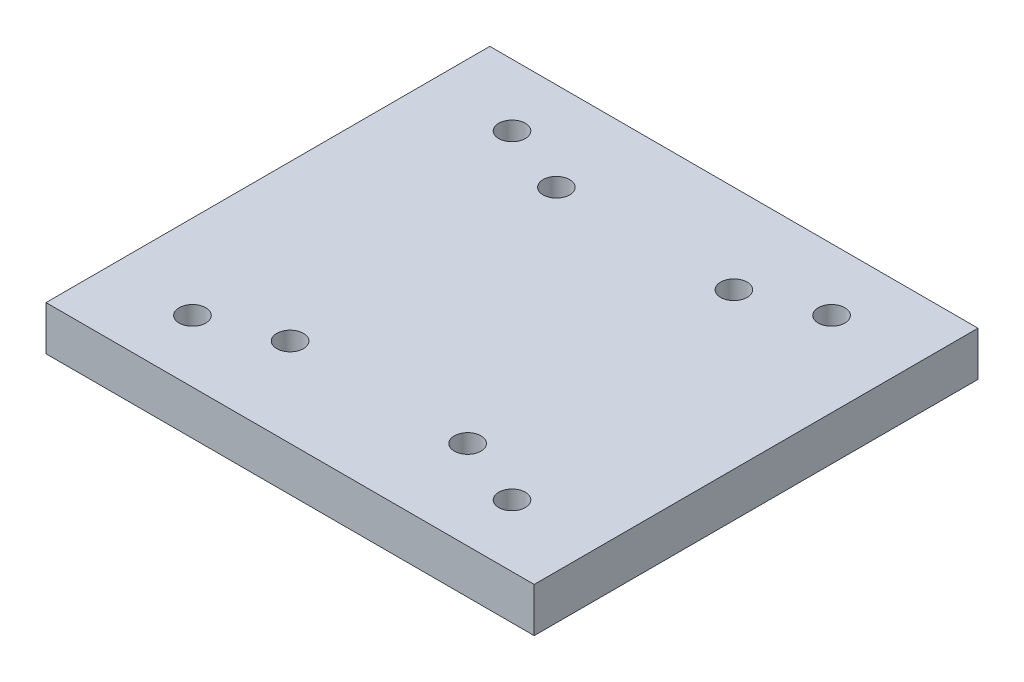
ISO-10303-21;
HEADER;
FILE_DESCRIPTION(('STEP AP214'),'2;1');
FILE_NAME('part.step','',(''),(''),'','','');
FILE_SCHEMA(('AUTOMOTIVE_DESIGN { 1 0 10303 214 1 1 1 1 }'));
ENDSEC;
DATA;
#1=APPLICATION_CONTEXT('core data for automotive mechanical design processes');
#2=APPLICATION_PROTOCOL_DEFINITION('international standard','automotive_design',2000,#1);
#3=PRODUCT_CONTEXT('',#1,'mechanical');
#4=PRODUCT('Part','Part','',(#3));
#5=PRODUCT_RELATED_PRODUCT_CATEGORY('part','',(#4));
#6=PRODUCT_DEFINITION_FORMATION('','',#4);
#7=PRODUCT_DEFINITION_CONTEXT('part definition',#1,'design');
#8=PRODUCT_DEFINITION('design','',#6,#7);
#9=PRODUCT_DEFINITION_SHAPE('','',#8);
#10=(LENGTH_UNIT() NAMED_UNIT(*) SI_UNIT(.MILLI.,.METRE.));
#11=(NAMED_UNIT(*) PLANE_ANGLE_UNIT() SI_UNIT($,.RADIAN.));
#12=(NAMED_UNIT(*) SI_UNIT($,.STERADIAN.) SOLID_ANGLE_UNIT());
#13=UNCERTAINTY_MEASURE_WITH_UNIT(LENGTH_MEASURE(1.E-05),#10,'distance_accuracy_value','');
#14=(GEOMETRIC_REPRESENTATION_CONTEXT(3) GLOBAL_UNCERTAINTY_ASSIGNED_CONTEXT((#13)) GLOBAL_UNIT_ASSIGNED_CONTEXT((#10,
#11,#12)) REPRESENTATION_CONTEXT('',''));
#15=CARTESIAN_POINT('',(0.,0.,0.));
#16=DIRECTION('',(0.,0.,1.));
#17=DIRECTION('',(1.,0.,0.));
#18=AXIS2_PLACEMENT_3D('',#15,#16,#17);
#19=CARTESIAN_POINT('',(27.5,5.,-25.));
#20=DIRECTION('',(-1.,0.,0.));
#21=DIRECTION('',(0.,0.,1.));
#22=AXIS2_PLACEMENT_3D('',#19,#20,#21);
#23=PLANE('',#22);
#24=DIRECTION('',(0.,0.,-1.));
#25=VECTOR('',#24,1.);
#26=CARTESIAN_POINT('',(27.5,0.,-25.));
#27=LINE('',#26,#25);
#28=CARTESIAN_POINT('',(27.5,0.,25.));
#29=VERTEX_POINT('',#28);
#30=CARTESIAN_POINT('',(27.5,0.,-25.));
#31=VERTEX_POINT('',#30);
#32=EDGE_CURVE('E110',#29,#31,#27,.T.);
#33=ORIENTED_EDGE('',*,*,#32,.T.);
#34=DIRECTION('',(0.,-1.,0.));
#35=VECTOR('',#34,1.);
#36=CARTESIAN_POINT('',(27.5,5.,-25.));
#37=LINE('',#36,#35);
#38=CARTESIAN_POINT('',(27.5,5.,-25.));
#39=VERTEX_POINT('',#38);
#40=EDGE_CURVE('E11',#39,#31,#37,.T.);
#41=ORIENTED_EDGE('',*,*,#40,.F.);
#42=DIRECTION('',(0.,0.,-1.));
#43=VECTOR('',#42,1.);
#44=CARTESIAN_POINT('',(27.5,5.,-25.));
#45=LINE('',#44,#43);
#46=CARTESIAN_POINT('',(27.5,5.,25.));
#47=VERTEX_POINT('',#46);
#48=EDGE_CURVE('E94',#47,#39,#45,.T.);
#49=ORIENTED_EDGE('',*,*,#48,.F.);
#50=DIRECTION('',(0.,-1.,0.));
#51=VECTOR('',#50,1.);
#52=CARTESIAN_POINT('',(27.5,5.,25.));
#53=LINE('',#52,#51);
#54=EDGE_CURVE('E103',#47,#29,#53,.T.);
#55=ORIENTED_EDGE('',*,*,#54,.T.);
#56=EDGE_LOOP('',(#33,#41,#49,#55));
#57=FACE_BOUND('',#56,.T.);
#58=ADVANCED_FACE('F41',(#57),#23,.F.);
#59=CARTESIAN_POINT('',(-27.5,5.,-25.));
#60=DIRECTION('',(0.,0.,1.));
#61=DIRECTION('',(1.,0.,0.));
#62=AXIS2_PLACEMENT_3D('',#59,#60,#61);
#63=PLANE('',#62);
#64=DIRECTION('',(-1.,0.,0.));
#65=VECTOR('',#64,1.);
#66=CARTESIAN_POINT('',(-27.5,0.,-25.));
#67=LINE('',#66,#65);
#68=CARTESIAN_POINT('',(-27.5,0.,-25.));
#69=VERTEX_POINT('',#68);
#70=EDGE_CURVE('E98',#31,#69,#67,.T.);
#71=ORIENTED_EDGE('',*,*,#70,.T.);
#72=DIRECTION('',(0.,-1.,0.));
#73=VECTOR('',#72,1.);
#74=CARTESIAN_POINT('',(-27.5,5.,-25.));
#75=LINE('',#74,#73);
#76=CARTESIAN_POINT('',(-27.5,5.,-25.));
#77=VERTEX_POINT('',#76);
#78=EDGE_CURVE('E49',#77,#69,#75,.T.);
#79=ORIENTED_EDGE('',*,*,#78,.F.);
#80=DIRECTION('',(-1.,0.,0.));
#81=VECTOR('',#80,1.);
#82=CARTESIAN_POINT('',(-27.5,5.,-25.));
#83=LINE('',#82,#81);
#84=EDGE_CURVE('E90',#39,#77,#83,.T.);
#85=ORIENTED_EDGE('',*,*,#84,.F.);
#86=ORIENTED_EDGE('',*,*,#40,.T.);
#87=EDGE_LOOP('',(#71,#79,#85,#86));
#88=FACE_BOUND('',#87,.T.);
#89=ADVANCED_FACE('F100',(#88),#63,.F.);
#90=CARTESIAN_POINT('',(-27.5,5.,-25.));
#91=DIRECTION('',(1.,0.,0.));
#92=DIRECTION('',(0.,0.,-1.));
#93=AXIS2_PLACEMENT_3D('',#90,#91,#92);
#94=PLANE('',#93);
#95=DIRECTION('',(0.,0.,1.));
#96=VECTOR('',#95,1.);
#97=CARTESIAN_POINT('',(-27.5,0.,-25.));
#98=LINE('',#97,#96);
#99=CARTESIAN_POINT('',(-27.5,0.,25.));
#100=VERTEX_POINT('',#99);
#101=EDGE_CURVE('E77',#69,#100,#98,.T.);
#102=ORIENTED_EDGE('',*,*,#101,.T.);
#103=DIRECTION('',(0.,-1.,0.));
#104=VECTOR('',#103,1.);
#105=CARTESIAN_POINT('',(-27.5,5.,25.));
#106=LINE('',#105,#104);
#107=CARTESIAN_POINT('',(-27.5,5.,25.));
#108=VERTEX_POINT('',#107);
#109=EDGE_CURVE('E97',#108,#100,#106,.T.);
#110=ORIENTED_EDGE('',*,*,#109,.F.);
#111=DIRECTION('',(0.,0.,1.));
#112=VECTOR('',#111,1.);
#113=CARTESIAN_POINT('',(-27.5,5.,-25.));
#114=LINE('',#113,#112);
#115=EDGE_CURVE('E95',#77,#108,#114,.T.);
#116=ORIENTED_EDGE('',*,*,#115,.F.);
#117=ORIENTED_EDGE('',*,*,#78,.T.);
#118=EDGE_LOOP('',(#102,#110,#116,#117));
#119=FACE_BOUND('',#118,.T.);
#120=ADVANCED_FACE('F101',(#119),#94,.F.);
#121=CARTESIAN_POINT('',(-27.5,5.,25.));
#122=DIRECTION('',(0.,0.,-1.));
#123=DIRECTION('',(-1.,0.,0.));
#124=AXIS2_PLACEMENT_3D('',#121,#122,#123);
#125=PLANE('',#124);
#126=DIRECTION('',(1.,0.,0.));
#127=VECTOR('',#126,1.);
#128=CARTESIAN_POINT('',(-27.5,0.,25.));
#129=LINE('',#128,#127);
#130=EDGE_CURVE('E85',#100,#29,#129,.T.);
#131=ORIENTED_EDGE('',*,*,#130,.T.);
#132=ORIENTED_EDGE('',*,*,#54,.F.);
#133=DIRECTION('',(1.,0.,0.));
#134=VECTOR('',#133,1.);
#135=CARTESIAN_POINT('',(-27.5,5.,25.));
#136=LINE('',#135,#134);
#137=EDGE_CURVE('E56',#108,#47,#136,.T.);
#138=ORIENTED_EDGE('',*,*,#137,.F.);
#139=ORIENTED_EDGE('',*,*,#109,.T.);
#140=EDGE_LOOP('',(#131,#132,#138,#139));
#141=FACE_BOUND('',#140,.T.);
#142=ADVANCED_FACE('F171',(#141),#125,.F.);
#143=CARTESIAN_POINT('',(0.,5.,0.));
#144=DIRECTION('',(0.,1.,0.));
#145=DIRECTION('',(0.,0.,1.));
#146=AXIS2_PLACEMENT_3D('',#143,#144,#145);
#147=PLANE('',#146);
#148=CARTESIAN_POINT('',(-10.,5.,15.));
#149=DIRECTION('',(0.,1.,0.));
#150=DIRECTION('',(0.,0.,1.));
#151=AXIS2_PLACEMENT_3D('',#148,#149,#150);
#152=CIRCLE('',#151,1.5);
#153=CARTESIAN_POINT('',(-10.,5.,16.5));
#154=VERTEX_POINT('',#153);
#155=EDGE_CURVE('E285',#154,#154,#152,.T.);
#156=ORIENTED_EDGE('',*,*,#155,.F.);
#157=EDGE_LOOP('',(#156));
#158=FACE_BOUND('',#157,.T.);
#159=CARTESIAN_POINT('',(10.,5.,15.));
#160=DIRECTION('',(0.,1.,0.));
#161=DIRECTION('',(0.,0.,1.));
#162=AXIS2_PLACEMENT_3D('',#159,#160,#161);
#163=CIRCLE('',#162,1.5);
#164=CARTESIAN_POINT('',(10.,5.,16.5));
#165=VERTEX_POINT('',#164);
#166=EDGE_CURVE('E283',#165,#165,#163,.T.);
#167=ORIENTED_EDGE('',*,*,#166,.F.);
#168=EDGE_LOOP('',(#167));
#169=FACE_BOUND('',#168,.T.);
#170=CARTESIAN_POINT('',(9.99999999999999,5.,-15.));
#171=DIRECTION('',(0.,1.,0.));
#172=DIRECTION('',(0.,0.,1.));
#173=AXIS2_PLACEMENT_3D('',#170,#171,#172);
#174=CIRCLE('',#173,1.5);
#175=CARTESIAN_POINT('',(9.99999999999999,5.,-13.5));
#176=VERTEX_POINT('',#175);
#177=EDGE_CURVE('E281',#176,#176,#174,.T.);
#178=ORIENTED_EDGE('',*,*,#177,.F.);
#179=EDGE_LOOP('',(#178));
#180=FACE_BOUND('',#179,.T.);
#181=CARTESIAN_POINT('',(-10.,5.,-15.));
#182=DIRECTION('',(0.,1.,0.));
#183=DIRECTION('',(0.,0.,1.));
#184=AXIS2_PLACEMENT_3D('',#181,#182,#183);
#185=CIRCLE('',#184,1.5);
#186=CARTESIAN_POINT('',(-10.,5.,-13.5));
#187=VERTEX_POINT('',#186);
#188=EDGE_CURVE('E116',#187,#187,#185,.T.);
#189=ORIENTED_EDGE('',*,*,#188,.F.);
#190=EDGE_LOOP('',(#189));
#191=FACE_BOUND('',#190,.T.);
#192=CARTESIAN_POINT('',(-18.,5.,18.));
#193=DIRECTION('',(0.,1.,0.));
#194=DIRECTION('',(0.,0.,1.));
#195=AXIS2_PLACEMENT_3D('',#192,#193,#194);
#196=CIRCLE('',#195,1.5);
#197=CARTESIAN_POINT('',(-18.,5.,19.5));
#198=VERTEX_POINT('',#197);
#199=EDGE_CURVE('E132',#198,#198,#196,.T.);
#200=ORIENTED_EDGE('',*,*,#199,.F.);
#201=EDGE_LOOP('',(#200));
#202=FACE_BOUND('',#201,.T.);
#203=CARTESIAN_POINT('',(18.,5.,18.));
#204=DIRECTION('',(0.,1.,0.));
#205=DIRECTION('',(0.,0.,1.));
#206=AXIS2_PLACEMENT_3D('',#203,#204,#205);
#207=CIRCLE('',#206,1.5);
#208=CARTESIAN_POINT('',(18.,5.,19.5));
#209=VERTEX_POINT('',#208);
#210=EDGE_CURVE('E153',#209,#209,#207,.T.);
#211=ORIENTED_EDGE('',*,*,#210,.F.);
#212=EDGE_LOOP('',(#211));
#213=FACE_BOUND('',#212,.T.);
#214=CARTESIAN_POINT('',(18.,5.,-18.));
#215=DIRECTION('',(0.,1.,0.));
#216=DIRECTION('',(0.,0.,1.));
#217=AXIS2_PLACEMENT_3D('',#214,#215,#216);
#218=CIRCLE('',#217,1.5);
#219=CARTESIAN_POINT('',(18.,5.,-16.5));
#220=VERTEX_POINT('',#219);
#221=EDGE_CURVE('E145',#220,#220,#218,.T.);
#222=ORIENTED_EDGE('',*,*,#221,.F.);
#223=EDGE_LOOP('',(#222));
#224=FACE_BOUND('',#223,.T.);
#225=CARTESIAN_POINT('',(-18.,5.,-18.));
#226=DIRECTION('',(0.,1.,0.));
#227=DIRECTION('',(0.,0.,1.));
#228=AXIS2_PLACEMENT_3D('',#225,#226,#227);
#229=CIRCLE('',#228,1.5);
#230=CARTESIAN_POINT('',(-18.,5.,-16.5));
#231=VERTEX_POINT('',#230);
#232=EDGE_CURVE('E142',#231,#231,#229,.T.);
#233=ORIENTED_EDGE('',*,*,#232,.F.);
#234=EDGE_LOOP('',(#233));
#235=FACE_BOUND('',#234,.T.);
#236=ORIENTED_EDGE('',*,*,#48,.T.);
#237=ORIENTED_EDGE('',*,*,#84,.T.);
#238=ORIENTED_EDGE('',*,*,#115,.T.);
#239=ORIENTED_EDGE('',*,*,#137,.T.);
#240=EDGE_LOOP('',(#236,#237,#238,#239));
#241=FACE_BOUND('',#240,.T.);
#242=ADVANCED_FACE('F89',(#158,#169,#180,#191,#202,#213,#224,#235,#241),#147,.T.);
#243=CARTESIAN_POINT('',(0.,0.,0.));
#244=DIRECTION('',(0.,1.,0.));
#245=DIRECTION('',(0.,0.,1.));
#246=AXIS2_PLACEMENT_3D('',#243,#244,#245);
#247=PLANE('',#246);
#248=CARTESIAN_POINT('',(-10.,0.,15.));
#249=DIRECTION('',(0.,1.,0.));
#250=DIRECTION('',(0.,0.,1.));
#251=AXIS2_PLACEMENT_3D('',#248,#249,#250);
#252=CIRCLE('',#251,1.5);
#253=CARTESIAN_POINT('',(-10.,0.,16.5));
#254=VERTEX_POINT('',#253);
#255=EDGE_CURVE('E42',#254,#254,#252,.T.);
#256=ORIENTED_EDGE('',*,*,#255,.T.);
#257=EDGE_LOOP('',(#256));
#258=FACE_BOUND('',#257,.T.);
#259=CARTESIAN_POINT('',(10.,0.,15.));
#260=DIRECTION('',(0.,1.,0.));
#261=DIRECTION('',(0.,0.,1.));
#262=AXIS2_PLACEMENT_3D('',#259,#260,#261);
#263=CIRCLE('',#262,1.5);
#264=CARTESIAN_POINT('',(10.,0.,16.5));
#265=VERTEX_POINT('',#264);
#266=EDGE_CURVE('E125',#265,#265,#263,.T.);
#267=ORIENTED_EDGE('',*,*,#266,.T.);
#268=EDGE_LOOP('',(#267));
#269=FACE_BOUND('',#268,.T.);
#270=CARTESIAN_POINT('',(9.99999999999999,0.,-15.));
#271=DIRECTION('',(0.,1.,0.));
#272=DIRECTION('',(0.,0.,1.));
#273=AXIS2_PLACEMENT_3D('',#270,#271,#272);
#274=CIRCLE('',#273,1.5);
#275=CARTESIAN_POINT('',(9.99999999999999,0.,-13.5));
#276=VERTEX_POINT('',#275);
#277=EDGE_CURVE('E119',#276,#276,#274,.T.);
#278=ORIENTED_EDGE('',*,*,#277,.T.);
#279=EDGE_LOOP('',(#278));
#280=FACE_BOUND('',#279,.T.);
#281=CARTESIAN_POINT('',(-10.,0.,-15.));
#282=DIRECTION('',(0.,1.,0.));
#283=DIRECTION('',(0.,0.,1.));
#284=AXIS2_PLACEMENT_3D('',#281,#282,#283);
#285=CIRCLE('',#284,1.5);
#286=CARTESIAN_POINT('',(-10.,0.,-13.5));
#287=VERTEX_POINT('',#286);
#288=EDGE_CURVE('E117',#287,#287,#285,.T.);
#289=ORIENTED_EDGE('',*,*,#288,.T.);
#290=EDGE_LOOP('',(#289));
#291=FACE_BOUND('',#290,.T.);
#292=CARTESIAN_POINT('',(-18.,0.,18.));
#293=DIRECTION('',(0.,1.,0.));
#294=DIRECTION('',(0.,0.,1.));
#295=AXIS2_PLACEMENT_3D('',#292,#293,#294);
#296=CIRCLE('',#295,1.5);
#297=CARTESIAN_POINT('',(-18.,0.,19.5));
#298=VERTEX_POINT('',#297);
#299=EDGE_CURVE('E130',#298,#298,#296,.T.);
#300=ORIENTED_EDGE('',*,*,#299,.T.);
#301=EDGE_LOOP('',(#300));
#302=FACE_BOUND('',#301,.T.);
#303=CARTESIAN_POINT('',(18.,0.,18.));
#304=DIRECTION('',(0.,1.,0.));
#305=DIRECTION('',(0.,0.,1.));
#306=AXIS2_PLACEMENT_3D('',#303,#304,#305);
#307=CIRCLE('',#306,1.5);
#308=CARTESIAN_POINT('',(18.,0.,19.5));
#309=VERTEX_POINT('',#308);
#310=EDGE_CURVE('E137',#309,#309,#307,.T.);
#311=ORIENTED_EDGE('',*,*,#310,.T.);
#312=EDGE_LOOP('',(#311));
#313=FACE_BOUND('',#312,.T.);
#314=CARTESIAN_POINT('',(18.,0.,-18.));
#315=DIRECTION('',(0.,1.,0.));
#316=DIRECTION('',(0.,0.,1.));
#317=AXIS2_PLACEMENT_3D('',#314,#315,#316);
#318=CIRCLE('',#317,1.5);
#319=CARTESIAN_POINT('',(18.,0.,-16.5));
#320=VERTEX_POINT('',#319);
#321=EDGE_CURVE('E146',#320,#320,#318,.T.);
#322=ORIENTED_EDGE('',*,*,#321,.T.);
#323=EDGE_LOOP('',(#322));
#324=FACE_BOUND('',#323,.T.);
#325=CARTESIAN_POINT('',(-18.,0.,-18.));
#326=DIRECTION('',(0.,1.,0.));
#327=DIRECTION('',(0.,0.,1.));
#328=AXIS2_PLACEMENT_3D('',#325,#326,#327);
#329=CIRCLE('',#328,1.5);
#330=CARTESIAN_POINT('',(-18.,0.,-16.5));
#331=VERTEX_POINT('',#330);
#332=EDGE_CURVE('E109',#331,#331,#329,.T.);
#333=ORIENTED_EDGE('',*,*,#332,.T.);
#334=EDGE_LOOP('',(#333));
#335=FACE_BOUND('',#334,.T.);
#336=ORIENTED_EDGE('',*,*,#32,.F.);
#337=ORIENTED_EDGE('',*,*,#130,.F.);
#338=ORIENTED_EDGE('',*,*,#101,.F.);
#339=ORIENTED_EDGE('',*,*,#70,.F.);
#340=EDGE_LOOP('',(#336,#337,#338,#339));
#341=FACE_BOUND('',#340,.T.);
#342=ADVANCED_FACE('F165',(#258,#269,#280,#291,#302,#313,#324,#335,#341),#247,.F.);
#343=CARTESIAN_POINT('',(-18.,0.,-18.));
#344=DIRECTION('',(0.,1.,0.));
#345=DIRECTION('',(0.,0.,1.));
#346=AXIS2_PLACEMENT_3D('',#343,#344,#345);
#347=CYLINDRICAL_SURFACE('',#346,1.5);
#348=ORIENTED_EDGE('',*,*,#332,.F.);
#349=EDGE_LOOP('',(#348));
#350=FACE_BOUND('',#349,.T.);
#351=ORIENTED_EDGE('',*,*,#232,.T.);
#352=EDGE_LOOP('',(#351));
#353=FACE_BOUND('',#352,.T.);
#354=ADVANCED_FACE('F181',(#350,#353),#347,.F.);
#355=CARTESIAN_POINT('',(18.,0.,-18.));
#356=DIRECTION('',(0.,1.,0.));
#357=DIRECTION('',(0.,0.,1.));
#358=AXIS2_PLACEMENT_3D('',#355,#356,#357);
#359=CYLINDRICAL_SURFACE('',#358,1.5);
#360=ORIENTED_EDGE('',*,*,#321,.F.);
#361=EDGE_LOOP('',(#360));
#362=FACE_BOUND('',#361,.T.);
#363=ORIENTED_EDGE('',*,*,#221,.T.);
#364=EDGE_LOOP('',(#363));
#365=FACE_BOUND('',#364,.T.);
#366=ADVANCED_FACE('F166',(#362,#365),#359,.F.);
#367=CARTESIAN_POINT('',(18.,0.,18.));
#368=DIRECTION('',(0.,1.,0.));
#369=DIRECTION('',(0.,0.,1.));
#370=AXIS2_PLACEMENT_3D('',#367,#368,#369);
#371=CYLINDRICAL_SURFACE('',#370,1.5);
#372=ORIENTED_EDGE('',*,*,#310,.F.);
#373=EDGE_LOOP('',(#372));
#374=FACE_BOUND('',#373,.T.);
#375=ORIENTED_EDGE('',*,*,#210,.T.);
#376=EDGE_LOOP('',(#375));
#377=FACE_BOUND('',#376,.T.);
#378=ADVANCED_FACE('F164',(#374,#377),#371,.F.);
#379=CARTESIAN_POINT('',(-18.,0.,18.));
#380=DIRECTION('',(0.,1.,0.));
#381=DIRECTION('',(0.,0.,1.));
#382=AXIS2_PLACEMENT_3D('',#379,#380,#381);
#383=CYLINDRICAL_SURFACE('',#382,1.5);
#384=ORIENTED_EDGE('',*,*,#299,.F.);
#385=EDGE_LOOP('',(#384));
#386=FACE_BOUND('',#385,.T.);
#387=ORIENTED_EDGE('',*,*,#199,.T.);
#388=EDGE_LOOP('',(#387));
#389=FACE_BOUND('',#388,.T.);
#390=ADVANCED_FACE('F169',(#386,#389),#383,.F.);
#391=CARTESIAN_POINT('',(-10.,-5.,-15.));
#392=DIRECTION('',(0.,1.,0.));
#393=DIRECTION('',(0.,0.,1.));
#394=AXIS2_PLACEMENT_3D('',#391,#392,#393);
#395=CYLINDRICAL_SURFACE('',#394,1.5);
#396=ORIENTED_EDGE('',*,*,#188,.T.);
#397=EDGE_LOOP('',(#396));
#398=FACE_BOUND('',#397,.T.);
#399=ORIENTED_EDGE('',*,*,#288,.F.);
#400=EDGE_LOOP('',(#399));
#401=FACE_BOUND('',#400,.T.);
#402=ADVANCED_FACE('F231',(#398,#401),#395,.F.);
#403=CARTESIAN_POINT('',(9.99999999999999,-5.,-15.));
#404=DIRECTION('',(0.,1.,0.));
#405=DIRECTION('',(0.,0.,1.));
#406=AXIS2_PLACEMENT_3D('',#403,#404,#405);
#407=CYLINDRICAL_SURFACE('',#406,1.5);
#408=ORIENTED_EDGE('',*,*,#177,.T.);
#409=EDGE_LOOP('',(#408));
#410=FACE_BOUND('',#409,.T.);
#411=ORIENTED_EDGE('',*,*,#277,.F.);
#412=EDGE_LOOP('',(#411));
#413=FACE_BOUND('',#412,.T.);
#414=ADVANCED_FACE('F250',(#410,#413),#407,.F.);
#415=CARTESIAN_POINT('',(10.,-5.,15.));
#416=DIRECTION('',(0.,1.,0.));
#417=DIRECTION('',(0.,0.,1.));
#418=AXIS2_PLACEMENT_3D('',#415,#416,#417);
#419=CYLINDRICAL_SURFACE('',#418,1.5);
#420=ORIENTED_EDGE('',*,*,#166,.T.);
#421=EDGE_LOOP('',(#420));
#422=FACE_BOUND('',#421,.T.);
#423=ORIENTED_EDGE('',*,*,#266,.F.);
#424=EDGE_LOOP('',(#423));
#425=FACE_BOUND('',#424,.T.);
#426=ADVANCED_FACE('F260',(#422,#425),#419,.F.);
#427=CARTESIAN_POINT('',(-10.,-5.,15.));
#428=DIRECTION('',(0.,1.,0.));
#429=DIRECTION('',(0.,0.,1.));
#430=AXIS2_PLACEMENT_3D('',#427,#428,#429);
#431=CYLINDRICAL_SURFACE('',#430,1.5);
#432=ORIENTED_EDGE('',*,*,#155,.T.);
#433=EDGE_LOOP('',(#432));
#434=FACE_BOUND('',#433,.T.);
#435=ORIENTED_EDGE('',*,*,#255,.F.);
#436=EDGE_LOOP('',(#435));
#437=FACE_BOUND('',#436,.T.);
#438=ADVANCED_FACE('F270',(#434,#437),#431,.F.);
#439=CLOSED_SHELL('',(#58,#89,#120,#142,#242,#342,#354,#366,#378,#390,#402,#414,#426,#438));
#440=MANIFOLD_SOLID_BREP('B2',#439);
#441=ADVANCED_BREP_SHAPE_REPRESENTATION('',(#18,#440),#14);
#442=SHAPE_DEFINITION_REPRESENTATION(#9,#441);
ENDSEC;
END-ISO-10303-21;
